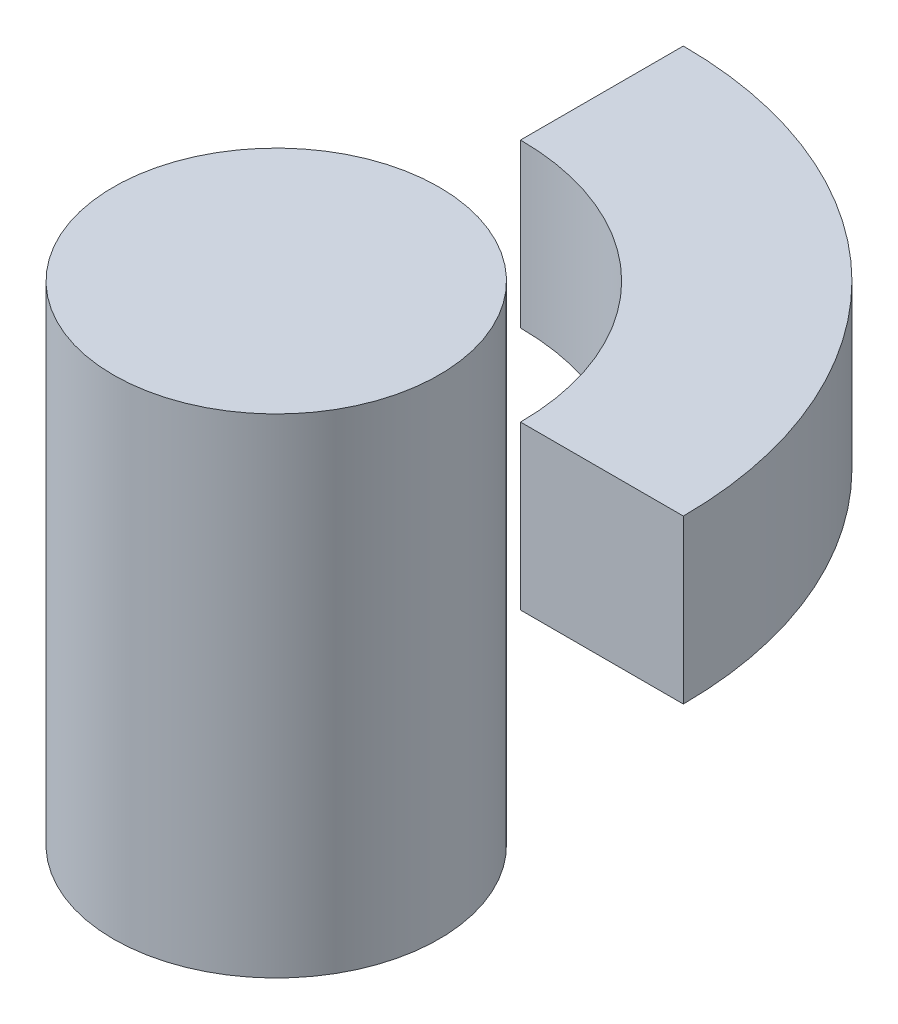
ISO-10303-21;
HEADER;
FILE_DESCRIPTION(('STEP AP214'),'2;1');
FILE_NAME('part.step','',(''),(''),'','','');
FILE_SCHEMA(('AUTOMOTIVE_DESIGN { 1 0 10303 214 1 1 1 1 }'));
ENDSEC;
DATA;
#1=APPLICATION_CONTEXT('core data for automotive mechanical design processes');
#2=APPLICATION_PROTOCOL_DEFINITION('international standard','automotive_design',2000,#1);
#3=PRODUCT_CONTEXT('',#1,'mechanical');
#4=PRODUCT('Part','Part','',(#3));
#5=PRODUCT_RELATED_PRODUCT_CATEGORY('part','',(#4));
#6=PRODUCT_DEFINITION_FORMATION('','',#4);
#7=PRODUCT_DEFINITION_CONTEXT('part definition',#1,'design');
#8=PRODUCT_DEFINITION('design','',#6,#7);
#9=PRODUCT_DEFINITION_SHAPE('','',#8);
#10=(LENGTH_UNIT() NAMED_UNIT(*) SI_UNIT(.MILLI.,.METRE.));
#11=(NAMED_UNIT(*) PLANE_ANGLE_UNIT() SI_UNIT($,.RADIAN.));
#12=(NAMED_UNIT(*) SI_UNIT($,.STERADIAN.) SOLID_ANGLE_UNIT());
#13=UNCERTAINTY_MEASURE_WITH_UNIT(LENGTH_MEASURE(1.E-05),#10,'distance_accuracy_value','');
#14=(GEOMETRIC_REPRESENTATION_CONTEXT(3) GLOBAL_UNCERTAINTY_ASSIGNED_CONTEXT((#13)) GLOBAL_UNIT_ASSIGNED_CONTEXT((#10,
#11,#12)) REPRESENTATION_CONTEXT('',''));
#15=CARTESIAN_POINT('',(0.,0.,0.));
#16=DIRECTION('',(0.,0.,1.));
#17=DIRECTION('',(1.,0.,0.));
#18=AXIS2_PLACEMENT_3D('',#15,#16,#17);
#19=CARTESIAN_POINT('',(20.,-15.,0.));
#20=DIRECTION('',(0.,-1.,0.));
#21=DIRECTION('',(0.,0.,-1.));
#22=AXIS2_PLACEMENT_3D('',#19,#20,#21);
#23=CYLINDRICAL_SURFACE('',#22,15.);
#24=CARTESIAN_POINT('',(20.,15.,0.));
#25=DIRECTION('',(0.,-1.,0.));
#26=DIRECTION('',(0.,0.,-1.));
#27=AXIS2_PLACEMENT_3D('',#24,#25,#26);
#28=CIRCLE('',#27,15.);
#29=CARTESIAN_POINT('',(20.,15.,-15.));
#30=VERTEX_POINT('',#29);
#31=CARTESIAN_POINT('',(35.,15.,0.));
#32=VERTEX_POINT('',#31);
#33=EDGE_CURVE('E12',#30,#32,#28,.T.);
#34=ORIENTED_EDGE('',*,*,#33,.F.);
#35=DIRECTION('',(0.,-1.,0.));
#36=VECTOR('',#35,1.);
#37=CARTESIAN_POINT('',(20.,5.,-15.));
#38=LINE('',#37,#36);
#39=CARTESIAN_POINT('',(20.,5.,-15.));
#40=VERTEX_POINT('',#39);
#41=EDGE_CURVE('E84',#30,#40,#38,.T.);
#42=ORIENTED_EDGE('',*,*,#41,.T.);
#43=CARTESIAN_POINT('',(20.,5.,0.));
#44=DIRECTION('',(0.,-1.,0.));
#45=DIRECTION('',(0.,0.,-1.));
#46=AXIS2_PLACEMENT_3D('',#43,#44,#45);
#47=CIRCLE('',#46,15.);
#48=CARTESIAN_POINT('',(35.,5.,0.));
#49=VERTEX_POINT('',#48);
#50=EDGE_CURVE('E79',#40,#49,#47,.T.);
#51=ORIENTED_EDGE('',*,*,#50,.T.);
#52=DIRECTION('',(0.,-1.,0.));
#53=VECTOR('',#52,1.);
#54=CARTESIAN_POINT('',(35.,5.,0.));
#55=LINE('',#54,#53);
#56=EDGE_CURVE('E82',#32,#49,#55,.T.);
#57=ORIENTED_EDGE('',*,*,#56,.F.);
#58=EDGE_LOOP('',(#34,#42,#51,#57));
#59=FACE_BOUND('',#58,.T.);
#60=ADVANCED_FACE('F43',(#59),#23,.F.);
#61=CARTESIAN_POINT('',(20.,15.,-15.));
#62=DIRECTION('',(0.,1.,0.));
#63=DIRECTION('',(0.,0.,1.));
#64=AXIS2_PLACEMENT_3D('',#61,#62,#63);
#65=PLANE('',#64);
#66=CARTESIAN_POINT('',(20.,15.,0.));
#67=DIRECTION('',(0.,-1.,0.));
#68=DIRECTION('',(0.,0.,-1.));
#69=AXIS2_PLACEMENT_3D('',#66,#67,#68);
#70=CIRCLE('',#69,25.);
#71=CARTESIAN_POINT('',(20.,15.,-25.));
#72=VERTEX_POINT('',#71);
#73=CARTESIAN_POINT('',(45.,15.,0.));
#74=VERTEX_POINT('',#73);
#75=EDGE_CURVE('E51',#72,#74,#70,.T.);
#76=ORIENTED_EDGE('',*,*,#75,.F.);
#77=DIRECTION('',(0.,0.,1.));
#78=VECTOR('',#77,1.);
#79=CARTESIAN_POINT('',(20.,15.,-15.));
#80=LINE('',#79,#78);
#81=EDGE_CURVE('E89',#72,#30,#80,.T.);
#82=ORIENTED_EDGE('',*,*,#81,.T.);
#83=ORIENTED_EDGE('',*,*,#33,.T.);
#84=DIRECTION('',(-1.,0.,0.));
#85=VECTOR('',#84,1.);
#86=CARTESIAN_POINT('',(35.,15.,0.));
#87=LINE('',#86,#85);
#88=EDGE_CURVE('E101',#74,#32,#87,.T.);
#89=ORIENTED_EDGE('',*,*,#88,.F.);
#90=EDGE_LOOP('',(#76,#82,#83,#89));
#91=FACE_BOUND('',#90,.T.);
#92=ADVANCED_FACE('F45',(#91),#65,.T.);
#93=CARTESIAN_POINT('',(20.,-15.,0.));
#94=DIRECTION('',(0.,-1.,0.));
#95=DIRECTION('',(0.,0.,-1.));
#96=AXIS2_PLACEMENT_3D('',#93,#94,#95);
#97=CYLINDRICAL_SURFACE('',#96,25.);
#98=CARTESIAN_POINT('',(20.,5.,0.));
#99=DIRECTION('',(0.,-1.,0.));
#100=DIRECTION('',(0.,0.,-1.));
#101=AXIS2_PLACEMENT_3D('',#98,#99,#100);
#102=CIRCLE('',#101,25.);
#103=CARTESIAN_POINT('',(20.,5.,-25.));
#104=VERTEX_POINT('',#103);
#105=CARTESIAN_POINT('',(45.,5.,0.));
#106=VERTEX_POINT('',#105);
#107=EDGE_CURVE('E88',#104,#106,#102,.T.);
#108=ORIENTED_EDGE('',*,*,#107,.F.);
#109=DIRECTION('',(0.,1.,0.));
#110=VECTOR('',#109,1.);
#111=CARTESIAN_POINT('',(20.,5.,-25.));
#112=LINE('',#111,#110);
#113=EDGE_CURVE('E109',#104,#72,#112,.T.);
#114=ORIENTED_EDGE('',*,*,#113,.T.);
#115=ORIENTED_EDGE('',*,*,#75,.T.);
#116=DIRECTION('',(0.,1.,0.));
#117=VECTOR('',#116,1.);
#118=CARTESIAN_POINT('',(45.,5.,0.));
#119=LINE('',#118,#117);
#120=EDGE_CURVE('E97',#106,#74,#119,.T.);
#121=ORIENTED_EDGE('',*,*,#120,.F.);
#122=EDGE_LOOP('',(#108,#114,#115,#121));
#123=FACE_BOUND('',#122,.T.);
#124=ADVANCED_FACE('F113',(#123),#97,.T.);
#125=CARTESIAN_POINT('',(20.,5.,-15.));
#126=DIRECTION('',(0.,-1.,0.));
#127=DIRECTION('',(0.,0.,-1.));
#128=AXIS2_PLACEMENT_3D('',#125,#126,#127);
#129=PLANE('',#128);
#130=DIRECTION('',(0.,0.,-1.));
#131=VECTOR('',#130,1.);
#132=CARTESIAN_POINT('',(20.,5.,-15.));
#133=LINE('',#132,#131);
#134=EDGE_CURVE('E107',#40,#104,#133,.T.);
#135=ORIENTED_EDGE('',*,*,#134,.T.);
#136=ORIENTED_EDGE('',*,*,#107,.T.);
#137=DIRECTION('',(1.,0.,0.));
#138=VECTOR('',#137,1.);
#139=CARTESIAN_POINT('',(35.,5.,0.));
#140=LINE('',#139,#138);
#141=EDGE_CURVE('E92',#49,#106,#140,.T.);
#142=ORIENTED_EDGE('',*,*,#141,.F.);
#143=ORIENTED_EDGE('',*,*,#50,.F.);
#144=EDGE_LOOP('',(#135,#136,#142,#143));
#145=FACE_BOUND('',#144,.T.);
#146=ADVANCED_FACE('F93',(#145),#129,.T.);
#147=CARTESIAN_POINT('',(20.,0.,20.));
#148=DIRECTION('',(-1.,0.,0.));
#149=DIRECTION('',(0.,0.,1.));
#150=AXIS2_PLACEMENT_3D('',#147,#148,#149);
#151=PLANE('',#150);
#152=ORIENTED_EDGE('',*,*,#41,.F.);
#153=ORIENTED_EDGE('',*,*,#81,.F.);
#154=ORIENTED_EDGE('',*,*,#113,.F.);
#155=ORIENTED_EDGE('',*,*,#134,.F.);
#156=EDGE_LOOP('',(#152,#153,#154,#155));
#157=FACE_BOUND('',#156,.T.);
#158=ADVANCED_FACE('F117',(#157),#151,.T.);
#159=CARTESIAN_POINT('',(0.,0.,0.));
#160=DIRECTION('',(0.,0.,-1.));
#161=DIRECTION('',(-1.,0.,0.));
#162=AXIS2_PLACEMENT_3D('',#159,#160,#161);
#163=PLANE('',#162);
#164=ORIENTED_EDGE('',*,*,#56,.T.);
#165=ORIENTED_EDGE('',*,*,#141,.T.);
#166=ORIENTED_EDGE('',*,*,#120,.T.);
#167=ORIENTED_EDGE('',*,*,#88,.T.);
#168=EDGE_LOOP('',(#164,#165,#166,#167));
#169=FACE_BOUND('',#168,.T.);
#170=ADVANCED_FACE('F100',(#169),#163,.F.);
#171=CLOSED_SHELL('',(#60,#92,#124,#146,#158,#170));
#172=MANIFOLD_SOLID_BREP('B2',#171);
#173=CARTESIAN_POINT('',(20.,-15.,0.));
#174=DIRECTION('',(0.,1.,0.));
#175=DIRECTION('',(0.,0.,1.));
#176=AXIS2_PLACEMENT_3D('',#173,#174,#175);
#177=CYLINDRICAL_SURFACE('',#176,10.);
#178=CARTESIAN_POINT('',(20.,-15.,0.));
#179=DIRECTION('',(0.,1.,0.));
#180=DIRECTION('',(0.,0.,1.));
#181=AXIS2_PLACEMENT_3D('',#178,#179,#180);
#182=CIRCLE('',#181,10.);
#183=CARTESIAN_POINT('',(20.,-15.,10.));
#184=VERTEX_POINT('',#183);
#185=EDGE_CURVE('E42',#184,#184,#182,.T.);
#186=ORIENTED_EDGE('',*,*,#185,.T.);
#187=EDGE_LOOP('',(#186));
#188=FACE_BOUND('',#187,.T.);
#189=CARTESIAN_POINT('',(20.,15.,0.));
#190=DIRECTION('',(0.,1.,0.));
#191=DIRECTION('',(0.,0.,1.));
#192=AXIS2_PLACEMENT_3D('',#189,#190,#191);
#193=CIRCLE('',#192,10.);
#194=CARTESIAN_POINT('',(20.,15.,10.));
#195=VERTEX_POINT('',#194);
#196=EDGE_CURVE('E173',#195,#195,#193,.T.);
#197=ORIENTED_EDGE('',*,*,#196,.F.);
#198=EDGE_LOOP('',(#197));
#199=FACE_BOUND('',#198,.T.);
#200=ADVANCED_FACE('F167',(#188,#199),#177,.T.);
#201=CARTESIAN_POINT('',(20.,-15.,0.));
#202=DIRECTION('',(0.,1.,0.));
#203=DIRECTION('',(0.,0.,1.));
#204=AXIS2_PLACEMENT_3D('',#201,#202,#203);
#205=PLANE('',#204);
#206=ORIENTED_EDGE('',*,*,#185,.F.);
#207=EDGE_LOOP('',(#206));
#208=FACE_BOUND('',#207,.T.);
#209=ADVANCED_FACE('F182',(#208),#205,.F.);
#210=CARTESIAN_POINT('',(20.,15.,0.));
#211=DIRECTION('',(0.,1.,0.));
#212=DIRECTION('',(0.,0.,1.));
#213=AXIS2_PLACEMENT_3D('',#210,#211,#212);
#214=PLANE('',#213);
#215=ORIENTED_EDGE('',*,*,#196,.T.);
#216=EDGE_LOOP('',(#215));
#217=FACE_BOUND('',#216,.T.);
#218=ADVANCED_FACE('F179',(#217),#214,.T.);
#219=CLOSED_SHELL('',(#200,#209,#218));
#220=MANIFOLD_SOLID_BREP('B6',#219);
#221=ADVANCED_BREP_SHAPE_REPRESENTATION('',(#18,#172,#220),#14);
#222=SHAPE_DEFINITION_REPRESENTATION(#9,#221);
ENDSEC;
END-ISO-10303-21;
